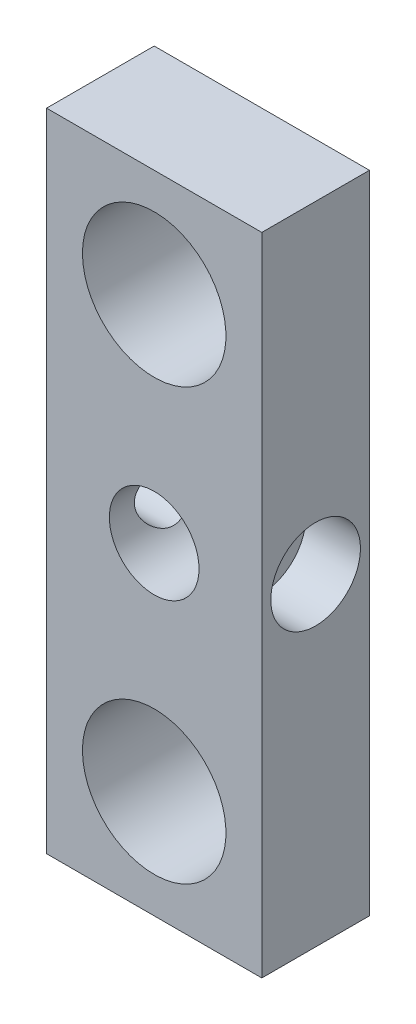
ISO-10303-21;
HEADER;
FILE_DESCRIPTION(('STEP AP214'),'2;1');
FILE_NAME('part.step','',(''),(''),'','','');
FILE_SCHEMA(('AUTOMOTIVE_DESIGN { 1 0 10303 214 1 1 1 1 }'));
ENDSEC;
DATA;
#1=APPLICATION_CONTEXT('core data for automotive mechanical design processes');
#2=APPLICATION_PROTOCOL_DEFINITION('international standard','automotive_design',2000,#1);
#3=PRODUCT_CONTEXT('',#1,'mechanical');
#4=PRODUCT('Part','Part','',(#3));
#5=PRODUCT_RELATED_PRODUCT_CATEGORY('part','',(#4));
#6=PRODUCT_DEFINITION_FORMATION('','',#4);
#7=PRODUCT_DEFINITION_CONTEXT('part definition',#1,'design');
#8=PRODUCT_DEFINITION('design','',#6,#7);
#9=PRODUCT_DEFINITION_SHAPE('','',#8);
#10=(LENGTH_UNIT() NAMED_UNIT(*) SI_UNIT(.MILLI.,.METRE.));
#11=(NAMED_UNIT(*) PLANE_ANGLE_UNIT() SI_UNIT($,.RADIAN.));
#12=(NAMED_UNIT(*) SI_UNIT($,.STERADIAN.) SOLID_ANGLE_UNIT());
#13=UNCERTAINTY_MEASURE_WITH_UNIT(LENGTH_MEASURE(1.E-05),#10,'distance_accuracy_value','');
#14=(GEOMETRIC_REPRESENTATION_CONTEXT(3) GLOBAL_UNCERTAINTY_ASSIGNED_CONTEXT((#13)) GLOBAL_UNIT_ASSIGNED_CONTEXT((#10,
#11,#12)) REPRESENTATION_CONTEXT('',''));
#15=CARTESIAN_POINT('',(0.,0.,0.));
#16=DIRECTION('',(0.,0.,1.));
#17=DIRECTION('',(1.,0.,0.));
#18=AXIS2_PLACEMENT_3D('',#15,#16,#17);
#19=CARTESIAN_POINT('',(0.,0.,9.525));
#20=DIRECTION('',(0.,0.,-1.));
#21=DIRECTION('',(-1.,0.,0.));
#22=AXIS2_PLACEMENT_3D('',#19,#20,#21);
#23=PLANE('',#22);
#24=DIRECTION('',(0.,1.,0.));
#25=VECTOR('',#24,1.);
#26=CARTESIAN_POINT('',(9.52500000000003,-228.6,9.525));
#27=LINE('',#26,#25);
#28=CARTESIAN_POINT('',(9.52500000000003,-228.6,9.525));
#29=VERTEX_POINT('',#28);
#30=CARTESIAN_POINT('',(9.52500000000002,-171.45,9.525));
#31=VERTEX_POINT('',#30);
#32=EDGE_CURVE('E91',#29,#31,#27,.T.);
#33=ORIENTED_EDGE('',*,*,#32,.T.);
#34=DIRECTION('',(-1.,0.,0.));
#35=VECTOR('',#34,1.);
#36=CARTESIAN_POINT('',(-9.52499999999998,-171.45,9.525));
#37=LINE('',#36,#35);
#38=CARTESIAN_POINT('',(-9.52499999999998,-171.45,9.525));
#39=VERTEX_POINT('',#38);
#40=EDGE_CURVE('E86',#31,#39,#37,.T.);
#41=ORIENTED_EDGE('',*,*,#40,.T.);
#42=DIRECTION('',(0.,-1.,0.));
#43=VECTOR('',#42,1.);
#44=CARTESIAN_POINT('',(-9.52499999999998,-228.6,9.525));
#45=LINE('',#44,#43);
#46=CARTESIAN_POINT('',(-9.52499999999998,-228.6,9.525));
#47=VERTEX_POINT('',#46);
#48=EDGE_CURVE('E89',#39,#47,#45,.T.);
#49=ORIENTED_EDGE('',*,*,#48,.T.);
#50=DIRECTION('',(1.,0.,0.));
#51=VECTOR('',#50,1.);
#52=CARTESIAN_POINT('',(-9.52499999999998,-228.6,9.525));
#53=LINE('',#52,#51);
#54=EDGE_CURVE('E56',#47,#29,#53,.T.);
#55=ORIENTED_EDGE('',*,*,#54,.T.);
#56=EDGE_LOOP('',(#33,#41,#49,#55));
#57=FACE_BOUND('',#56,.T.);
#58=CARTESIAN_POINT('',(0.,-200.025,9.525));
#59=DIRECTION('',(0.,0.,1.));
#60=DIRECTION('',(1.,0.,0.));
#61=AXIS2_PLACEMENT_3D('',#58,#59,#60);
#62=CIRCLE('',#61,3.96875);
#63=CARTESIAN_POINT('',(3.96875000000001,-200.025,9.525));
#64=VERTEX_POINT('',#63);
#65=EDGE_CURVE('E107',#64,#64,#62,.T.);
#66=ORIENTED_EDGE('',*,*,#65,.F.);
#67=EDGE_LOOP('',(#66));
#68=FACE_BOUND('',#67,.T.);
#69=CARTESIAN_POINT('',(0.,-180.975,9.525));
#70=DIRECTION('',(0.,0.,1.));
#71=DIRECTION('',(1.,0.,0.));
#72=AXIS2_PLACEMENT_3D('',#69,#70,#71);
#73=CIRCLE('',#72,6.34999999999999);
#74=CARTESIAN_POINT('',(-6.34999999999999,-180.975,9.525));
#75=VERTEX_POINT('',#74);
#76=EDGE_CURVE('E187',#75,#75,#73,.T.);
#77=ORIENTED_EDGE('',*,*,#76,.F.);
#78=EDGE_LOOP('',(#77));
#79=FACE_BOUND('',#78,.T.);
#80=CARTESIAN_POINT('',(0.,-219.075,9.525));
#81=DIRECTION('',(0.,0.,1.));
#82=DIRECTION('',(-1.,0.,0.));
#83=AXIS2_PLACEMENT_3D('',#80,#81,#82);
#84=CIRCLE('',#83,6.34999999999999);
#85=CARTESIAN_POINT('',(-6.34999999999998,-219.075,9.525));
#86=VERTEX_POINT('',#85);
#87=EDGE_CURVE('E179',#86,#86,#84,.T.);
#88=ORIENTED_EDGE('',*,*,#87,.F.);
#89=EDGE_LOOP('',(#88));
#90=FACE_BOUND('',#89,.T.);
#91=ADVANCED_FACE('F33',(#57,#68,#79,#90),#23,.F.);
#92=CARTESIAN_POINT('',(0.,0.,0.));
#93=DIRECTION('',(0.,0.,-1.));
#94=DIRECTION('',(-1.,0.,0.));
#95=AXIS2_PLACEMENT_3D('',#92,#93,#94);
#96=PLANE('',#95);
#97=CARTESIAN_POINT('',(0.,-180.975,0.));
#98=DIRECTION('',(0.,0.,1.));
#99=DIRECTION('',(1.,0.,0.));
#100=AXIS2_PLACEMENT_3D('',#97,#98,#99);
#101=CIRCLE('',#100,6.34999999999999);
#102=CARTESIAN_POINT('',(-6.34999999999999,-180.975,0.));
#103=VERTEX_POINT('',#102);
#104=EDGE_CURVE('E182',#103,#103,#101,.T.);
#105=ORIENTED_EDGE('',*,*,#104,.T.);
#106=EDGE_LOOP('',(#105));
#107=FACE_BOUND('',#106,.T.);
#108=DIRECTION('',(0.,1.,0.));
#109=VECTOR('',#108,1.);
#110=CARTESIAN_POINT('',(9.52500000000003,-228.6,0.));
#111=LINE('',#110,#109);
#112=CARTESIAN_POINT('',(9.52500000000003,-228.6,0.));
#113=VERTEX_POINT('',#112);
#114=CARTESIAN_POINT('',(9.52500000000002,-171.45,0.));
#115=VERTEX_POINT('',#114);
#116=EDGE_CURVE('E104',#113,#115,#111,.T.);
#117=ORIENTED_EDGE('',*,*,#116,.F.);
#118=DIRECTION('',(1.,0.,0.));
#119=VECTOR('',#118,1.);
#120=CARTESIAN_POINT('',(-9.52499999999998,-228.6,0.));
#121=LINE('',#120,#119);
#122=CARTESIAN_POINT('',(-9.52499999999998,-228.6,0.));
#123=VERTEX_POINT('',#122);
#124=EDGE_CURVE('E79',#123,#113,#121,.T.);
#125=ORIENTED_EDGE('',*,*,#124,.F.);
#126=DIRECTION('',(0.,-1.,0.));
#127=VECTOR('',#126,1.);
#128=CARTESIAN_POINT('',(-9.52499999999998,-228.6,0.));
#129=LINE('',#128,#127);
#130=CARTESIAN_POINT('',(-9.52499999999998,-171.45,0.));
#131=VERTEX_POINT('',#130);
#132=EDGE_CURVE('E73',#131,#123,#129,.T.);
#133=ORIENTED_EDGE('',*,*,#132,.F.);
#134=DIRECTION('',(-1.,0.,0.));
#135=VECTOR('',#134,1.);
#136=CARTESIAN_POINT('',(-9.52499999999998,-171.45,0.));
#137=LINE('',#136,#135);
#138=EDGE_CURVE('E95',#115,#131,#137,.T.);
#139=ORIENTED_EDGE('',*,*,#138,.F.);
#140=EDGE_LOOP('',(#117,#125,#133,#139));
#141=FACE_BOUND('',#140,.T.);
#142=CARTESIAN_POINT('',(0.,-200.025,0.));
#143=DIRECTION('',(0.,0.,1.));
#144=DIRECTION('',(1.,0.,0.));
#145=AXIS2_PLACEMENT_3D('',#142,#143,#144);
#146=CIRCLE('',#145,3.96875);
#147=CARTESIAN_POINT('',(3.96875000000001,-200.025,0.));
#148=VERTEX_POINT('',#147);
#149=EDGE_CURVE('E174',#148,#148,#146,.T.);
#150=ORIENTED_EDGE('',*,*,#149,.T.);
#151=EDGE_LOOP('',(#150));
#152=FACE_BOUND('',#151,.T.);
#153=CARTESIAN_POINT('',(0.,-219.075,0.));
#154=DIRECTION('',(0.,0.,1.));
#155=DIRECTION('',(-1.,0.,0.));
#156=AXIS2_PLACEMENT_3D('',#153,#154,#155);
#157=CIRCLE('',#156,6.34999999999999);
#158=CARTESIAN_POINT('',(-6.34999999999998,-219.075,0.));
#159=VERTEX_POINT('',#158);
#160=EDGE_CURVE('E177',#159,#159,#157,.T.);
#161=ORIENTED_EDGE('',*,*,#160,.T.);
#162=EDGE_LOOP('',(#161));
#163=FACE_BOUND('',#162,.T.);
#164=ADVANCED_FACE('F146',(#107,#141,#152,#163),#96,.T.);
#165=CARTESIAN_POINT('',(9.52500000000003,-228.6,9.525));
#166=DIRECTION('',(-1.,0.,0.));
#167=DIRECTION('',(0.,-1.,0.));
#168=AXIS2_PLACEMENT_3D('',#165,#166,#167);
#169=PLANE('',#168);
#170=CARTESIAN_POINT('',(9.52500000000002,-200.025,4.7625));
#171=DIRECTION('',(1.,0.,0.));
#172=DIRECTION('',(0.,0.,-1.));
#173=AXIS2_PLACEMENT_3D('',#170,#171,#172);
#174=CIRCLE('',#173,3.96874999999999);
#175=CARTESIAN_POINT('',(9.52500000000002,-200.025,0.793750000000009));
#176=VERTEX_POINT('',#175);
#177=EDGE_CURVE('E167',#176,#176,#174,.T.);
#178=ORIENTED_EDGE('',*,*,#177,.F.);
#179=EDGE_LOOP('',(#178));
#180=FACE_BOUND('',#179,.T.);
#181=ORIENTED_EDGE('',*,*,#116,.T.);
#182=DIRECTION('',(0.,0.,-1.));
#183=VECTOR('',#182,1.);
#184=CARTESIAN_POINT('',(9.52500000000002,-171.45,9.525));
#185=LINE('',#184,#183);
#186=EDGE_CURVE('E11',#31,#115,#185,.T.);
#187=ORIENTED_EDGE('',*,*,#186,.F.);
#188=ORIENTED_EDGE('',*,*,#32,.F.);
#189=DIRECTION('',(0.,0.,-1.));
#190=VECTOR('',#189,1.);
#191=CARTESIAN_POINT('',(9.52500000000003,-228.6,9.525));
#192=LINE('',#191,#190);
#193=EDGE_CURVE('E100',#29,#113,#192,.T.);
#194=ORIENTED_EDGE('',*,*,#193,.T.);
#195=EDGE_LOOP('',(#181,#187,#188,#194));
#196=FACE_BOUND('',#195,.T.);
#197=ADVANCED_FACE('F35',(#180,#196),#169,.F.);
#198=CARTESIAN_POINT('',(-9.52499999999998,-171.45,9.525));
#199=DIRECTION('',(0.,-1.,0.));
#200=DIRECTION('',(0.,0.,-1.));
#201=AXIS2_PLACEMENT_3D('',#198,#199,#200);
#202=PLANE('',#201);
#203=ORIENTED_EDGE('',*,*,#138,.T.);
#204=DIRECTION('',(0.,0.,-1.));
#205=VECTOR('',#204,1.);
#206=CARTESIAN_POINT('',(-9.52499999999998,-171.45,9.525));
#207=LINE('',#206,#205);
#208=EDGE_CURVE('E47',#39,#131,#207,.T.);
#209=ORIENTED_EDGE('',*,*,#208,.F.);
#210=ORIENTED_EDGE('',*,*,#40,.F.);
#211=ORIENTED_EDGE('',*,*,#186,.T.);
#212=EDGE_LOOP('',(#203,#209,#210,#211));
#213=FACE_BOUND('',#212,.T.);
#214=ADVANCED_FACE('F94',(#213),#202,.F.);
#215=CARTESIAN_POINT('',(-9.52499999999998,-228.6,9.525));
#216=DIRECTION('',(1.,0.,0.));
#217=DIRECTION('',(0.,1.,0.));
#218=AXIS2_PLACEMENT_3D('',#215,#216,#217);
#219=PLANE('',#218);
#220=CARTESIAN_POINT('',(-9.52499999999998,-200.025,4.7625));
#221=DIRECTION('',(1.,0.,0.));
#222=DIRECTION('',(0.,0.,-1.));
#223=AXIS2_PLACEMENT_3D('',#220,#221,#222);
#224=CIRCLE('',#223,2.55269999999999);
#225=CARTESIAN_POINT('',(-9.52499999999998,-200.025,2.20980000000001));
#226=VERTEX_POINT('',#225);
#227=EDGE_CURVE('E116',#226,#226,#224,.T.);
#228=ORIENTED_EDGE('',*,*,#227,.T.);
#229=EDGE_LOOP('',(#228));
#230=FACE_BOUND('',#229,.T.);
#231=ORIENTED_EDGE('',*,*,#132,.T.);
#232=DIRECTION('',(0.,0.,-1.));
#233=VECTOR('',#232,1.);
#234=CARTESIAN_POINT('',(-9.52499999999998,-228.6,9.525));
#235=LINE('',#234,#233);
#236=EDGE_CURVE('E96',#47,#123,#235,.T.);
#237=ORIENTED_EDGE('',*,*,#236,.F.);
#238=ORIENTED_EDGE('',*,*,#48,.F.);
#239=ORIENTED_EDGE('',*,*,#208,.T.);
#240=EDGE_LOOP('',(#231,#237,#238,#239));
#241=FACE_BOUND('',#240,.T.);
#242=ADVANCED_FACE('F98',(#230,#241),#219,.F.);
#243=CARTESIAN_POINT('',(-9.52499999999998,-228.6,9.525));
#244=DIRECTION('',(0.,1.,0.));
#245=DIRECTION('',(-1.,0.,0.));
#246=AXIS2_PLACEMENT_3D('',#243,#244,#245);
#247=PLANE('',#246);
#248=ORIENTED_EDGE('',*,*,#124,.T.);
#249=ORIENTED_EDGE('',*,*,#193,.F.);
#250=ORIENTED_EDGE('',*,*,#54,.F.);
#251=ORIENTED_EDGE('',*,*,#236,.T.);
#252=EDGE_LOOP('',(#248,#249,#250,#251));
#253=FACE_BOUND('',#252,.T.);
#254=ADVANCED_FACE('F141',(#253),#247,.F.);
#255=CARTESIAN_POINT('',(0.,-200.025,9.525));
#256=DIRECTION('',(0.,0.,-1.));
#257=DIRECTION('',(-1.,0.,0.));
#258=AXIS2_PLACEMENT_3D('',#255,#256,#257);
#259=CYLINDRICAL_SURFACE('',#258,3.96875);
#260=CARTESIAN_POINT('',(-3.96874999999999,-200.025,7.31519999999999));
#261=CARTESIAN_POINT('',(-3.96874288995877,-200.154100035397,7.31519239574755));
#262=CARTESIAN_POINT('',(-3.96239014442926,-200.283271929131,7.30534632098476));
#263=CARTESIAN_POINT('',(-3.9375926328164,-200.537557801145,7.26652704471239));
#264=CARTESIAN_POINT('',(-3.91913556813452,-200.662667516212,7.23753438910167));
#265=CARTESIAN_POINT('',(-3.87197245024943,-200.904745521398,7.16215197052856));
#266=CARTESIAN_POINT('',(-3.84331494650177,-201.021749293489,7.11584456608937));
#267=CARTESIAN_POINT('',(-3.7780980221099,-201.245900501831,7.00775723747599));
#268=CARTESIAN_POINT('',(-3.74153808977505,-201.353047299192,6.94597631133373));
#269=CARTESIAN_POINT('',(-3.65993919868051,-201.564376556599,6.80313211359416));
#270=CARTESIAN_POINT('',(-3.61445050002937,-201.667593092694,6.72090203976858));
#271=CARTESIAN_POINT('',(-3.52083856561401,-201.859698422032,6.54221954000098));
#272=CARTESIAN_POINT('',(-3.47271176556907,-201.948567157604,6.44574755874971));
#273=CARTESIAN_POINT('',(-3.37084437712008,-202.122604917032,6.22498782667975));
#274=CARTESIAN_POINT('',(-3.31730224750105,-202.205366926242,6.09869512459455));
#275=CARTESIAN_POINT('',(-3.21881655375193,-202.348304597213,5.83089470657257));
#276=CARTESIAN_POINT('',(-3.17385827591932,-202.408519081497,5.68941368767127));
#277=CARTESIAN_POINT('',(-3.11048712498131,-202.490311932018,5.43425180305238));
#278=CARTESIAN_POINT('',(-3.0881796497314,-202.51794567079,5.32348716695601));
#279=CARTESIAN_POINT('',(-3.05525831739712,-202.558193615777,5.09763400530854));
#280=CARTESIAN_POINT('',(-3.04462641697261,-202.570830999683,4.98255243658675));
#281=CARTESIAN_POINT('',(-3.03667651804736,-202.580312099832,4.75089022819935));
#282=CARTESIAN_POINT('',(-3.0394011156832,-202.577105285987,4.63430597663047));
#283=CARTESIAN_POINT('',(-3.05781275661559,-202.555009354282,4.40364168877021));
#284=CARTESIAN_POINT('',(-3.07351054528606,-202.536107236327,4.28956380888184));
#285=CARTESIAN_POINT('',(-3.11486559466004,-202.484597907209,4.07044221409866));
#286=CARTESIAN_POINT('',(-3.14019500424728,-202.452439191463,3.96522736320292));
#287=CARTESIAN_POINT('',(-3.1979828307048,-202.375783072805,3.76152316458199));
#288=CARTESIAN_POINT('',(-3.23044360746821,-202.331281584174,3.66303605736037));
#289=CARTESIAN_POINT('',(-3.30645936251751,-202.221266805434,3.45518103807285));
#290=CARTESIAN_POINT('',(-3.35094390379248,-202.153349598475,3.34742723809918));
#291=CARTESIAN_POINT('',(-3.44197036874696,-202.002770464495,3.14361705500284));
#292=CARTESIAN_POINT('',(-3.48851469581537,-201.920090952168,3.04757485528988));
#293=CARTESIAN_POINT('',(-3.58855142656399,-201.724264090888,2.85164582571457));
#294=CARTESIAN_POINT('',(-3.64172468838826,-201.608310140354,2.75437037311523));
#295=CARTESIAN_POINT('',(-3.740304894133,-201.358802404642,2.58069362539337));
#296=CARTESIAN_POINT('',(-3.78572002016536,-201.225267427868,2.50427028714545));
#297=CARTESIAN_POINT('',(-3.8560256205037,-200.971464979557,2.38849601252563));
#298=CARTESIAN_POINT('',(-3.88319999096843,-200.853813000873,2.3447995805729));
#299=CARTESIAN_POINT('',(-3.92708839224013,-200.611567401949,2.27491678582748));
#300=CARTESIAN_POINT('',(-3.9438108909968,-200.486979490465,2.24871624694428));
#301=CARTESIAN_POINT('',(-3.96529503931138,-200.233803459798,2.21514163454965));
#302=CARTESIAN_POINT('',(-3.97001527997666,-200.105203037131,2.20783273750842));
#303=CARTESIAN_POINT('',(-3.96690075676167,-199.848515731178,2.21267521291049));
#304=CARTESIAN_POINT('',(-3.95906542472272,-199.720428871393,2.22482746600028));
#305=CARTESIAN_POINT('',(-3.93238285529436,-199.475758607477,2.26666873160703));
#306=CARTESIAN_POINT('',(-3.91416626911603,-199.358930259486,2.29535440411375));
#307=CARTESIAN_POINT('',(-3.86872419212668,-199.132056487463,2.3681039843384));
#308=CARTESIAN_POINT('',(-3.84149719101009,-199.022012204231,2.41217047022157));
#309=CARTESIAN_POINT('',(-3.77777110584133,-198.802966074643,2.5177820302624));
#310=CARTESIAN_POINT('',(-3.74074139518548,-198.694623070284,2.58036582882888));
#311=CARTESIAN_POINT('',(-3.66131962651139,-198.489474120158,2.71950573789381));
#312=CARTESIAN_POINT('',(-3.61892351541568,-198.39267700311,2.79607242879957));
#313=CARTESIAN_POINT('',(-3.52498149191547,-198.197733158693,2.97436963458016));
#314=CARTESIAN_POINT('',(-3.47303024488055,-198.101661579763,3.0781588035964));
#315=CARTESIAN_POINT('',(-3.3707327954991,-197.927540775771,3.30068553254827));
#316=CARTESIAN_POINT('',(-3.32038699609809,-197.849496044989,3.41942680882271));
#317=CARTESIAN_POINT('',(-3.23315507810642,-197.722210976373,3.65397149851387));
#318=CARTESIAN_POINT('',(-3.19536965238836,-197.670534192412,3.76811394293822));
#319=CARTESIAN_POINT('',(-3.12971493827279,-197.583925058655,4.00534436345483));
#320=CARTESIAN_POINT('',(-3.10183210153404,-197.54896980819,4.12841983770966));
#321=CARTESIAN_POINT('',(-3.07052478181548,-197.510418430355,4.31819718523386));
#322=CARTESIAN_POINT('',(-3.06182348035192,-197.499862462419,4.38268767077191));
#323=CARTESIAN_POINT('',(-3.04843238405326,-197.483710835653,4.51268573907248));
#324=CARTESIAN_POINT('',(-3.04374046974626,-197.478112555995,4.57819276579235));
#325=CARTESIAN_POINT('',(-3.03861700071684,-197.472001773638,4.70958305668269));
#326=CARTESIAN_POINT('',(-3.03818354098362,-197.471486996845,4.77546613942598));
#327=CARTESIAN_POINT('',(-3.04158414028157,-197.475540222532,4.90694402258651));
#328=CARTESIAN_POINT('',(-3.04541782816428,-197.480107782961,4.97253884757769));
#329=CARTESIAN_POINT('',(-3.06129670590894,-197.499191456793,5.14842803197323));
#330=CARTESIAN_POINT('',(-3.07720928320341,-197.518430757786,5.25790626871106));
#331=CARTESIAN_POINT('',(-3.11874098847336,-197.570308672871,5.47166951756576));
#332=CARTESIAN_POINT('',(-3.14436976634308,-197.602960610769,5.57594924977039));
#333=CARTESIAN_POINT('',(-3.21255660700179,-197.693760277765,5.81260335751261));
#334=CARTESIAN_POINT('',(-3.25790538414438,-197.756815310382,5.94229284199566));
#335=CARTESIAN_POINT('',(-3.35459900916012,-197.902433968086,6.18778248015733));
#336=CARTESIAN_POINT('',(-3.40595296263275,-197.985027418265,6.3035609874417));
#337=CARTESIAN_POINT('',(-3.50976397652142,-198.169235489499,6.52118818488953));
#338=CARTESIAN_POINT('',(-3.56222675043007,-198.271079440187,6.62284021276039));
#339=CARTESIAN_POINT('',(-3.662587254342,-198.491677200751,6.80845474893499));
#340=CARTESIAN_POINT('',(-3.7104892298751,-198.610415022519,6.89243379848481));
#341=CARTESIAN_POINT('',(-3.79171652130198,-198.847078006889,7.03078794823429));
#342=CARTESIAN_POINT('',(-3.82611716667093,-198.963230143411,7.08755708018501));
#343=CARTESIAN_POINT('',(-3.88507625033696,-199.204908391698,7.18335766600571));
#344=CARTESIAN_POINT('',(-3.90965017430209,-199.330419381745,7.2224170413156));
#345=CARTESIAN_POINT('',(-3.94146624440678,-199.551160746579,7.27262133084724));
#346=CARTESIAN_POINT('',(-3.95164523341484,-199.644907881521,7.2885378973269));
#347=CARTESIAN_POINT('',(-3.96528997042524,-199.834090167235,7.30983040506741));
#348=CARTESIAN_POINT('',(-3.96875525815583,-199.929525433288,7.31520562364452));
#349=CARTESIAN_POINT('',(-3.96874999999999,-200.025,7.31519999999999));
#350=B_SPLINE_CURVE_WITH_KNOTS('',3,(#260,#261,#262,#263,#264,#265,#266,#267,#268,#269,#270,
#271,#272,#273,#274,#275,#276,#277,#278,#279,#280,#281,#282,#283,#284,#285,#286,#287,#288,#289,
#290,#291,#292,#293,#294,#295,#296,#297,#298,#299,#300,#301,#302,#303,#304,#305,#306,#307,#308,
#309,#310,#311,#312,#313,#314,#315,#316,#317,#318,#319,#320,#321,#322,#323,#324,#325,#326,#327,
#328,#329,#330,#331,#332,#333,#334,#335,#336,#337,#338,#339,#340,#341,#342,#343,#344,#345,#346,
#347,#348,#349),.UNSPECIFIED.,.T.,.F.,(4,2,2,2,2,2,2,2,2,2,2,2,2,2,2,2,2,2,2,2,2,2,2,2,2,2,2,2,
2,2,2,2,2,2,2,2,2,2,2,2,2,2,2,2,4),(0.,0.38691367811741,0.774221090380067,1.15970921715388,
1.54522231217408,1.96239237975703,2.38014067763134,2.85849211539694,3.33601609441295,
3.68355124766283,4.03054856374486,4.37865323166609,4.72704651540133,5.06451150888274,
5.40208834404886,5.8053809013845,6.20915711780945,6.68808384951322,7.16650232063056,
7.55010517606899,7.93339683798719,8.31800910803196,8.70263878285586,9.06607189442016,
9.42956595470904,9.81951674798394,10.2097638363838,10.6599352513404,11.1102187778516,
11.5013856960095,11.8920153540225,12.0895237460084,12.286927664944,12.4842432716233,
12.6815417175043,13.0167996147388,13.3523913579848,13.8034989086833,14.2552995628443,
14.7128669873816,15.1700042222516,15.5696940820669,15.9687515753719,16.2548698819666,
16.5410078033032),.UNSPECIFIED.);
#351=CARTESIAN_POINT('',(-3.96874999999999,-200.025,7.31519999999999));
#352=VERTEX_POINT('',#351);
#353=EDGE_CURVE('E37',#352,#352,#350,.T.);
#354=ORIENTED_EDGE('',*,*,#353,.F.);
#355=EDGE_LOOP('',(#354));
#356=FACE_BOUND('',#355,.T.);
#357=CARTESIAN_POINT('',(3.96875000000001,-200.025,2.20980000000001));
#358=CARTESIAN_POINT('',(3.96874288995878,-200.154100035397,2.20980760425245));
#359=CARTESIAN_POINT('',(3.96239014442928,-200.283271929131,2.21965367901524));
#360=CARTESIAN_POINT('',(3.93759263281642,-200.537557801145,2.25847295528762));
#361=CARTESIAN_POINT('',(3.91913556813454,-200.662667516212,2.28746561089834));
#362=CARTESIAN_POINT('',(3.87197245024944,-200.904745521398,2.36284802947145));
#363=CARTESIAN_POINT('',(3.84331494650179,-201.021749293489,2.40915543391063));
#364=CARTESIAN_POINT('',(3.77809802210991,-201.245900501831,2.51724276252401));
#365=CARTESIAN_POINT('',(3.74153808977506,-201.353047299192,2.57902368866628));
#366=CARTESIAN_POINT('',(3.65993919868052,-201.564376556599,2.72186788640586));
#367=CARTESIAN_POINT('',(3.61445050002938,-201.667593092694,2.80409796023144));
#368=CARTESIAN_POINT('',(3.52083856561403,-201.859698422032,2.98278045999903));
#369=CARTESIAN_POINT('',(3.47271176556909,-201.948567157604,3.07925244125029));
#370=CARTESIAN_POINT('',(3.3708443771201,-202.122604917032,3.30001217332025));
#371=CARTESIAN_POINT('',(3.31730224750107,-202.205366926242,3.42630487540546));
#372=CARTESIAN_POINT('',(3.21881655375195,-202.348304597213,3.69410529342744));
#373=CARTESIAN_POINT('',(3.17385827591933,-202.408519081497,3.83558631232875));
#374=CARTESIAN_POINT('',(3.11048712498132,-202.490311932018,4.09074819694764));
#375=CARTESIAN_POINT('',(3.08817964973142,-202.51794567079,4.20151283304401));
#376=CARTESIAN_POINT('',(3.05525831739714,-202.558193615777,4.42736599469148));
#377=CARTESIAN_POINT('',(3.04462641697262,-202.570830999683,4.54244756341327));
#378=CARTESIAN_POINT('',(3.03667651804738,-202.580312099832,4.77410977180067));
#379=CARTESIAN_POINT('',(3.03940111568322,-202.577105285987,4.89069402336955));
#380=CARTESIAN_POINT('',(3.0578127566156,-202.555009354282,5.12135831122981));
#381=CARTESIAN_POINT('',(3.07351054528608,-202.536107236327,5.23543619111818));
#382=CARTESIAN_POINT('',(3.11486559466006,-202.484597907209,5.45455778590136));
#383=CARTESIAN_POINT('',(3.1401950042473,-202.452439191463,5.5597726367971));
#384=CARTESIAN_POINT('',(3.19798283070482,-202.375783072805,5.76347683541803));
#385=CARTESIAN_POINT('',(3.23044360746822,-202.331281584174,5.86196394263964));
#386=CARTESIAN_POINT('',(3.30645936251753,-202.221266805434,6.06981896192716));
#387=CARTESIAN_POINT('',(3.3509439037925,-202.153349598475,6.17757276190082));
#388=CARTESIAN_POINT('',(3.44197036874698,-202.002770464495,6.38138294499717));
#389=CARTESIAN_POINT('',(3.48851469581539,-201.920090952168,6.47742514471013));
#390=CARTESIAN_POINT('',(3.58855142656401,-201.724264090888,6.67335417428544));
#391=CARTESIAN_POINT('',(3.64172468838828,-201.608310140354,6.77062962688478));
#392=CARTESIAN_POINT('',(3.74030489413302,-201.358802404642,6.94430637460665));
#393=CARTESIAN_POINT('',(3.78572002016539,-201.225267427868,7.02072971285457));
#394=CARTESIAN_POINT('',(3.85602562050372,-200.971464979557,7.13650398747439));
#395=CARTESIAN_POINT('',(3.88319999096846,-200.853813000873,7.18020041942712));
#396=CARTESIAN_POINT('',(3.92708839224015,-200.611567401949,7.25008321417254));
#397=CARTESIAN_POINT('',(3.94381089099682,-200.486979490465,7.27628375305573));
#398=CARTESIAN_POINT('',(3.96529503931141,-200.233803459798,7.30985836545036));
#399=CARTESIAN_POINT('',(3.97001527997668,-200.105203037131,7.31716726249159));
#400=CARTESIAN_POINT('',(3.96690075676168,-199.848515731178,7.31232478708951));
#401=CARTESIAN_POINT('',(3.95906542472273,-199.720428871393,7.30017253399971));
#402=CARTESIAN_POINT('',(3.93238285529435,-199.475758607477,7.25833126839294));
#403=CARTESIAN_POINT('',(3.91416626911602,-199.358930259486,7.22964559588621));
#404=CARTESIAN_POINT('',(3.86872419212667,-199.132056487463,7.15689601566155));
#405=CARTESIAN_POINT('',(3.84149719101007,-199.022012204231,7.11282952977838));
#406=CARTESIAN_POINT('',(3.77777110584131,-198.802966074643,7.00721796973754));
#407=CARTESIAN_POINT('',(3.74074139518545,-198.694623070284,6.94463417117104));
#408=CARTESIAN_POINT('',(3.66131962651135,-198.489474120158,6.8054942621061));
#409=CARTESIAN_POINT('',(3.61892351541565,-198.39267700311,6.72892757120034));
#410=CARTESIAN_POINT('',(3.52498149191543,-198.197733158693,6.55063036541975));
#411=CARTESIAN_POINT('',(3.47303024488052,-198.101661579763,6.44684119640351));
#412=CARTESIAN_POINT('',(3.37073279549907,-197.92754077577,6.22431446745163));
#413=CARTESIAN_POINT('',(3.32038699609806,-197.849496044989,6.10557319117718));
#414=CARTESIAN_POINT('',(3.2331550781064,-197.722210976373,5.87102850148602));
#415=CARTESIAN_POINT('',(3.19536965238834,-197.670534192412,5.75688605706167));
#416=CARTESIAN_POINT('',(3.12971493827278,-197.583925058655,5.51965563654506));
#417=CARTESIAN_POINT('',(3.10183210153404,-197.54896980819,5.39658016229024));
#418=CARTESIAN_POINT('',(3.07052478181548,-197.510418430354,5.20680281476604));
#419=CARTESIAN_POINT('',(3.06182348035193,-197.499862462419,5.142312329228));
#420=CARTESIAN_POINT('',(3.04843238405327,-197.483710835653,5.01231426092743));
#421=CARTESIAN_POINT('',(3.04374046974627,-197.478112555995,4.94680723420757));
#422=CARTESIAN_POINT('',(3.03861700071686,-197.472001773638,4.81541694331724));
#423=CARTESIAN_POINT('',(3.03818354098364,-197.471486996845,4.74953386057395));
#424=CARTESIAN_POINT('',(3.04158414028159,-197.475540222532,4.61805597741343));
#425=CARTESIAN_POINT('',(3.04541782816431,-197.480107782961,4.55246115242225));
#426=CARTESIAN_POINT('',(3.06129670590897,-197.499191456793,4.37657196802671));
#427=CARTESIAN_POINT('',(3.07720928320344,-197.518430757786,4.26709373128888));
#428=CARTESIAN_POINT('',(3.11874098847339,-197.570308672871,4.05333048243418));
#429=CARTESIAN_POINT('',(3.14436976634311,-197.602960610769,3.94905075022956));
#430=CARTESIAN_POINT('',(3.21255660700182,-197.693760277765,3.71239664248735));
#431=CARTESIAN_POINT('',(3.25790538414441,-197.756815310382,3.5827071580043));
#432=CARTESIAN_POINT('',(3.35459900916016,-197.902433968086,3.33721751984262));
#433=CARTESIAN_POINT('',(3.40595296263279,-197.985027418265,3.22143901255825));
#434=CARTESIAN_POINT('',(3.50976397652146,-198.169235489499,3.00381181511043));
#435=CARTESIAN_POINT('',(3.5622267504301,-198.271079440187,2.90215978723958));
#436=CARTESIAN_POINT('',(3.66258725434203,-198.491677200751,2.71654525106499));
#437=CARTESIAN_POINT('',(3.71048922987514,-198.610415022519,2.63256620151516));
#438=CARTESIAN_POINT('',(3.79171652130201,-198.847078006889,2.49421205176568));
#439=CARTESIAN_POINT('',(3.82611716667096,-198.963230143411,2.43744291981498));
#440=CARTESIAN_POINT('',(3.88507625033698,-199.204908391698,2.34164233399429));
#441=CARTESIAN_POINT('',(3.90965017430211,-199.330419381745,2.3025829586844));
#442=CARTESIAN_POINT('',(3.9414662444068,-199.551160746579,2.25237866915276));
#443=CARTESIAN_POINT('',(3.95164523341486,-199.644907881521,2.2364621026731));
#444=CARTESIAN_POINT('',(3.96528997042526,-199.834090167235,2.21516959493259));
#445=CARTESIAN_POINT('',(3.96875525815585,-199.929525433288,2.20979437635549));
#446=CARTESIAN_POINT('',(3.96875000000001,-200.025,2.20980000000001));
#447=B_SPLINE_CURVE_WITH_KNOTS('',3,(#357,#358,#359,#360,#361,#362,#363,#364,#365,#366,#367,
#368,#369,#370,#371,#372,#373,#374,#375,#376,#377,#378,#379,#380,#381,#382,#383,#384,#385,#386,
#387,#388,#389,#390,#391,#392,#393,#394,#395,#396,#397,#398,#399,#400,#401,#402,#403,#404,#405,
#406,#407,#408,#409,#410,#411,#412,#413,#414,#415,#416,#417,#418,#419,#420,#421,#422,#423,#424,
#425,#426,#427,#428,#429,#430,#431,#432,#433,#434,#435,#436,#437,#438,#439,#440,#441,#442,#443,
#444,#445,#446),.UNSPECIFIED.,.T.,.F.,(4,2,2,2,2,2,2,2,2,2,2,2,2,2,2,2,2,2,2,2,2,2,2,2,2,2,2,2,
2,2,2,2,2,2,2,2,2,2,2,2,2,2,2,2,4),(0.,0.386913678117409,0.774221090380067,1.15970921715385,
1.54522231217411,1.96239237975703,2.38014067763134,2.85849211539694,3.33601609441297,
3.68355124766284,4.03054856374487,4.3786532316661,4.72704651540134,5.06451150888274,
5.40208834404887,5.8053809013845,6.20915711780945,6.68808384951325,7.16650232063058,
7.55010517606905,7.93339683798727,8.31800910803207,8.702638782856,9.06607189442034,
9.42956595470917,9.81951674798408,10.2097638363839,10.6599352513405,11.1102187778517,
11.5013856960096,11.8920153540226,12.0895237460085,12.2869276649441,12.4842432716234,
12.6815417175043,13.0167996147389,13.3523913579848,13.8034989086833,14.2552995628444,
14.7128669873817,15.1700042222517,15.569694082067,15.9687515753719,16.2548698819666,
16.5410078033032),.UNSPECIFIED.);
#448=CARTESIAN_POINT('',(3.96875000000001,-200.025,2.20980000000001));
#449=VERTEX_POINT('',#448);
#450=EDGE_CURVE('E112',#449,#449,#447,.T.);
#451=ORIENTED_EDGE('',*,*,#450,.F.);
#452=EDGE_LOOP('',(#451));
#453=FACE_BOUND('',#452,.T.);
#454=ORIENTED_EDGE('',*,*,#65,.T.);
#455=EDGE_LOOP('',(#454));
#456=FACE_BOUND('',#455,.T.);
#457=ORIENTED_EDGE('',*,*,#149,.F.);
#458=EDGE_LOOP('',(#457));
#459=FACE_BOUND('',#458,.T.);
#460=ADVANCED_FACE('F117',(#356,#453,#456,#459),#259,.F.);
#461=CARTESIAN_POINT('',(0.,-180.975,9.525));
#462=DIRECTION('',(0.,0.,-1.));
#463=DIRECTION('',(-1.,0.,0.));
#464=AXIS2_PLACEMENT_3D('',#461,#462,#463);
#465=CYLINDRICAL_SURFACE('',#464,6.34999999999999);
#466=CARTESIAN_POINT('',(-6.34999999999999,-180.975,9.525));
#467=CARTESIAN_POINT('',(-6.34999999999999,-180.975,9.42578125));
#468=CARTESIAN_POINT('',(-6.34999999999999,-180.975,9.3265625));
#469=CARTESIAN_POINT('',(-6.34999999999999,-180.975,9.128125));
#470=CARTESIAN_POINT('',(-6.34999999999999,-180.975,9.02890625));
#471=CARTESIAN_POINT('',(-6.34999999999999,-180.975,8.83046875));
#472=CARTESIAN_POINT('',(-6.34999999999999,-180.975,8.73125));
#473=CARTESIAN_POINT('',(-6.34999999999999,-180.975,8.5328125));
#474=CARTESIAN_POINT('',(-6.34999999999999,-180.975,8.43359375));
#475=CARTESIAN_POINT('',(-6.34999999999999,-180.975,8.23515625));
#476=CARTESIAN_POINT('',(-6.34999999999999,-180.975,8.1359375));
#477=CARTESIAN_POINT('',(-6.34999999999999,-180.975,7.9375));
#478=CARTESIAN_POINT('',(-6.34999999999999,-180.975,7.83828125));
#479=CARTESIAN_POINT('',(-6.34999999999999,-180.975,7.63984375));
#480=CARTESIAN_POINT('',(-6.34999999999999,-180.975,7.540625));
#481=CARTESIAN_POINT('',(-6.34999999999999,-180.975,7.3421875));
#482=CARTESIAN_POINT('',(-6.34999999999999,-180.975,7.24296875));
#483=CARTESIAN_POINT('',(-6.34999999999999,-180.975,7.04453125));
#484=CARTESIAN_POINT('',(-6.34999999999999,-180.975,6.9453125));
#485=CARTESIAN_POINT('',(-6.34999999999999,-180.975,6.746875));
#486=CARTESIAN_POINT('',(-6.34999999999999,-180.975,6.64765625));
#487=CARTESIAN_POINT('',(-6.34999999999999,-180.975,6.44921875));
#488=CARTESIAN_POINT('',(-6.34999999999999,-180.975,6.35));
#489=CARTESIAN_POINT('',(-6.34999999999999,-180.975,6.1515625));
#490=CARTESIAN_POINT('',(-6.34999999999999,-180.975,6.05234375));
#491=CARTESIAN_POINT('',(-6.34999999999999,-180.975,5.85390625));
#492=CARTESIAN_POINT('',(-6.34999999999999,-180.975,5.7546875));
#493=CARTESIAN_POINT('',(-6.34999999999999,-180.975,5.55625));
#494=CARTESIAN_POINT('',(-6.34999999999999,-180.975,5.45703125));
#495=CARTESIAN_POINT('',(-6.34999999999999,-180.975,5.25859375));
#496=CARTESIAN_POINT('',(-6.34999999999999,-180.975,5.159375));
#497=CARTESIAN_POINT('',(-6.34999999999999,-180.975,4.9609375));
#498=CARTESIAN_POINT('',(-6.34999999999999,-180.975,4.86171875));
#499=CARTESIAN_POINT('',(-6.34999999999999,-180.975,4.66328125));
#500=CARTESIAN_POINT('',(-6.34999999999999,-180.975,4.5640625));
#501=CARTESIAN_POINT('',(-6.34999999999999,-180.975,4.365625));
#502=CARTESIAN_POINT('',(-6.34999999999999,-180.975,4.26640625));
#503=CARTESIAN_POINT('',(-6.34999999999999,-180.975,4.06796875));
#504=CARTESIAN_POINT('',(-6.34999999999999,-180.975,3.96875));
#505=CARTESIAN_POINT('',(-6.34999999999999,-180.975,3.7703125));
#506=CARTESIAN_POINT('',(-6.34999999999999,-180.975,3.67109375));
#507=CARTESIAN_POINT('',(-6.34999999999999,-180.975,3.47265625));
#508=CARTESIAN_POINT('',(-6.34999999999999,-180.975,3.3734375));
#509=CARTESIAN_POINT('',(-6.34999999999999,-180.975,3.175));
#510=CARTESIAN_POINT('',(-6.34999999999999,-180.975,3.07578125));
#511=CARTESIAN_POINT('',(-6.34999999999999,-180.975,2.87734375));
#512=CARTESIAN_POINT('',(-6.34999999999999,-180.975,2.778125));
#513=CARTESIAN_POINT('',(-6.34999999999999,-180.975,2.5796875));
#514=CARTESIAN_POINT('',(-6.34999999999999,-180.975,2.48046875));
#515=CARTESIAN_POINT('',(-6.34999999999999,-180.975,2.28203125));
#516=CARTESIAN_POINT('',(-6.34999999999999,-180.975,2.1828125));
#517=CARTESIAN_POINT('',(-6.34999999999999,-180.975,1.984375));
#518=CARTESIAN_POINT('',(-6.34999999999999,-180.975,1.88515625));
#519=CARTESIAN_POINT('',(-6.34999999999999,-180.975,1.68671875));
#520=CARTESIAN_POINT('',(-6.34999999999999,-180.975,1.5875));
#521=CARTESIAN_POINT('',(-6.34999999999999,-180.975,1.3890625));
#522=CARTESIAN_POINT('',(-6.34999999999999,-180.975,1.28984375));
#523=CARTESIAN_POINT('',(-6.34999999999999,-180.975,1.09140625));
#524=CARTESIAN_POINT('',(-6.34999999999999,-180.975,0.992187500000001));
#525=CARTESIAN_POINT('',(-6.34999999999999,-180.975,0.793750000000001));
#526=CARTESIAN_POINT('',(-6.34999999999999,-180.975,0.69453125));
#527=CARTESIAN_POINT('',(-6.34999999999999,-180.975,0.49609375));
#528=CARTESIAN_POINT('',(-6.34999999999999,-180.975,0.396875));
#529=CARTESIAN_POINT('',(-6.34999999999999,-180.975,0.1984375));
#530=CARTESIAN_POINT('',(-6.34999999999999,-180.975,0.0992187500000001));
#531=CARTESIAN_POINT('',(-6.34999999999999,-180.975,0.));
#532=B_SPLINE_CURVE_WITH_KNOTS('',3,(#466,#467,#468,#469,#470,#471,#472,#473,#474,#475,#476,
#477,#478,#479,#480,#481,#482,#483,#484,#485,#486,#487,#488,#489,#490,#491,#492,#493,#494,#495,
#496,#497,#498,#499,#500,#501,#502,#503,#504,#505,#506,#507,#508,#509,#510,#511,#512,#513,#514,
#515,#516,#517,#518,#519,#520,#521,#522,#523,#524,#525,#526,#527,#528,#529,#530,#531),
.UNSPECIFIED.,.F.,.F.,(4,2,2,2,2,2,2,2,2,2,2,2,2,2,2,2,2,2,2,2,2,2,2,2,2,2,2,2,2,2,2,2,4),(0.,
0.297656249999998,0.595312499999999,0.892968749999999,1.190625,1.48828125,1.7859375,2.08359375,
2.38125,2.67890625,2.9765625,3.27421875,3.571875,3.86953125,4.1671875,4.46484375,4.7625,
5.06015625,5.3578125,5.65546875,5.953125,6.25078125,6.5484375,6.84609375,7.14375,7.44140625,
7.7390625,8.03671875,8.334375,8.63203125,8.9296875,9.22734375,9.525),.UNSPECIFIED.);
#533=EDGE_CURVE('BSEAM134',#75,#103,#532,.T.);
#534=ORIENTED_EDGE('',*,*,#76,.T.);
#535=ORIENTED_EDGE('',*,*,#104,.F.);
#536=ORIENTED_EDGE('',*,*,#533,.T.);
#537=ORIENTED_EDGE('',*,*,#533,.F.);
#538=EDGE_LOOP('',(#534,#536,#535,#537));
#539=FACE_BOUND('',#538,.T.);
#540=ADVANCED_FACE('F134',(#539),#465,.F.);
#541=CARTESIAN_POINT('',(0.,-219.075,9.525));
#542=DIRECTION('',(0.,0.,-1.));
#543=DIRECTION('',(-1.,0.,0.));
#544=AXIS2_PLACEMENT_3D('',#541,#542,#543);
#545=CYLINDRICAL_SURFACE('',#544,6.34999999999999);
#546=CARTESIAN_POINT('',(-6.34999999999998,-219.075,9.525));
#547=CARTESIAN_POINT('',(-6.34999999999998,-219.075,9.42578125));
#548=CARTESIAN_POINT('',(-6.34999999999998,-219.075,9.3265625));
#549=CARTESIAN_POINT('',(-6.34999999999998,-219.075,9.128125));
#550=CARTESIAN_POINT('',(-6.34999999999998,-219.075,9.02890625));
#551=CARTESIAN_POINT('',(-6.34999999999998,-219.075,8.83046875));
#552=CARTESIAN_POINT('',(-6.34999999999998,-219.075,8.73125));
#553=CARTESIAN_POINT('',(-6.34999999999998,-219.075,8.5328125));
#554=CARTESIAN_POINT('',(-6.34999999999998,-219.075,8.43359375));
#555=CARTESIAN_POINT('',(-6.34999999999998,-219.075,8.23515625));
#556=CARTESIAN_POINT('',(-6.34999999999998,-219.075,8.1359375));
#557=CARTESIAN_POINT('',(-6.34999999999998,-219.075,7.9375));
#558=CARTESIAN_POINT('',(-6.34999999999998,-219.075,7.83828125));
#559=CARTESIAN_POINT('',(-6.34999999999998,-219.075,7.63984375));
#560=CARTESIAN_POINT('',(-6.34999999999998,-219.075,7.540625));
#561=CARTESIAN_POINT('',(-6.34999999999998,-219.075,7.3421875));
#562=CARTESIAN_POINT('',(-6.34999999999998,-219.075,7.24296875));
#563=CARTESIAN_POINT('',(-6.34999999999998,-219.075,7.04453125));
#564=CARTESIAN_POINT('',(-6.34999999999998,-219.075,6.9453125));
#565=CARTESIAN_POINT('',(-6.34999999999998,-219.075,6.746875));
#566=CARTESIAN_POINT('',(-6.34999999999998,-219.075,6.64765625));
#567=CARTESIAN_POINT('',(-6.34999999999998,-219.075,6.44921875));
#568=CARTESIAN_POINT('',(-6.34999999999998,-219.075,6.35));
#569=CARTESIAN_POINT('',(-6.34999999999998,-219.075,6.1515625));
#570=CARTESIAN_POINT('',(-6.34999999999998,-219.075,6.05234375));
#571=CARTESIAN_POINT('',(-6.34999999999998,-219.075,5.85390625));
#572=CARTESIAN_POINT('',(-6.34999999999998,-219.075,5.7546875));
#573=CARTESIAN_POINT('',(-6.34999999999998,-219.075,5.55625));
#574=CARTESIAN_POINT('',(-6.34999999999998,-219.075,5.45703125));
#575=CARTESIAN_POINT('',(-6.34999999999998,-219.075,5.25859375));
#576=CARTESIAN_POINT('',(-6.34999999999998,-219.075,5.159375));
#577=CARTESIAN_POINT('',(-6.34999999999998,-219.075,4.9609375));
#578=CARTESIAN_POINT('',(-6.34999999999998,-219.075,4.86171875));
#579=CARTESIAN_POINT('',(-6.34999999999998,-219.075,4.66328125));
#580=CARTESIAN_POINT('',(-6.34999999999998,-219.075,4.5640625));
#581=CARTESIAN_POINT('',(-6.34999999999998,-219.075,4.365625));
#582=CARTESIAN_POINT('',(-6.34999999999998,-219.075,4.26640625));
#583=CARTESIAN_POINT('',(-6.34999999999998,-219.075,4.06796875));
#584=CARTESIAN_POINT('',(-6.34999999999998,-219.075,3.96875));
#585=CARTESIAN_POINT('',(-6.34999999999998,-219.075,3.7703125));
#586=CARTESIAN_POINT('',(-6.34999999999998,-219.075,3.67109375));
#587=CARTESIAN_POINT('',(-6.34999999999998,-219.075,3.47265625));
#588=CARTESIAN_POINT('',(-6.34999999999998,-219.075,3.3734375));
#589=CARTESIAN_POINT('',(-6.34999999999998,-219.075,3.175));
#590=CARTESIAN_POINT('',(-6.34999999999998,-219.075,3.07578125));
#591=CARTESIAN_POINT('',(-6.34999999999998,-219.075,2.87734375));
#592=CARTESIAN_POINT('',(-6.34999999999998,-219.075,2.778125));
#593=CARTESIAN_POINT('',(-6.34999999999998,-219.075,2.5796875));
#594=CARTESIAN_POINT('',(-6.34999999999998,-219.075,2.48046875));
#595=CARTESIAN_POINT('',(-6.34999999999998,-219.075,2.28203125));
#596=CARTESIAN_POINT('',(-6.34999999999998,-219.075,2.1828125));
#597=CARTESIAN_POINT('',(-6.34999999999998,-219.075,1.984375));
#598=CARTESIAN_POINT('',(-6.34999999999998,-219.075,1.88515625));
#599=CARTESIAN_POINT('',(-6.34999999999998,-219.075,1.68671875));
#600=CARTESIAN_POINT('',(-6.34999999999998,-219.075,1.5875));
#601=CARTESIAN_POINT('',(-6.34999999999998,-219.075,1.3890625));
#602=CARTESIAN_POINT('',(-6.34999999999998,-219.075,1.28984375));
#603=CARTESIAN_POINT('',(-6.34999999999998,-219.075,1.09140625));
#604=CARTESIAN_POINT('',(-6.34999999999998,-219.075,0.992187500000001));
#605=CARTESIAN_POINT('',(-6.34999999999998,-219.075,0.793750000000001));
#606=CARTESIAN_POINT('',(-6.34999999999998,-219.075,0.69453125));
#607=CARTESIAN_POINT('',(-6.34999999999998,-219.075,0.49609375));
#608=CARTESIAN_POINT('',(-6.34999999999998,-219.075,0.396875));
#609=CARTESIAN_POINT('',(-6.34999999999998,-219.075,0.1984375));
#610=CARTESIAN_POINT('',(-6.34999999999998,-219.075,0.0992187500000001));
#611=CARTESIAN_POINT('',(-6.34999999999998,-219.075,0.));
#612=B_SPLINE_CURVE_WITH_KNOTS('',3,(#546,#547,#548,#549,#550,#551,#552,#553,#554,#555,#556,
#557,#558,#559,#560,#561,#562,#563,#564,#565,#566,#567,#568,#569,#570,#571,#572,#573,#574,#575,
#576,#577,#578,#579,#580,#581,#582,#583,#584,#585,#586,#587,#588,#589,#590,#591,#592,#593,#594,
#595,#596,#597,#598,#599,#600,#601,#602,#603,#604,#605,#606,#607,#608,#609,#610,#611),
.UNSPECIFIED.,.F.,.F.,(4,2,2,2,2,2,2,2,2,2,2,2,2,2,2,2,2,2,2,2,2,2,2,2,2,2,2,2,2,2,2,2,4),(0.,
0.297656249999998,0.595312499999999,0.892968749999999,1.190625,1.48828125,1.7859375,2.08359375,
2.38125,2.67890625,2.9765625,3.27421875,3.571875,3.86953125,4.1671875,4.46484375,4.7625,
5.06015625,5.3578125,5.65546875,5.953125,6.25078125,6.5484375,6.84609375,7.14375,7.44140625,
7.7390625,8.03671875,8.334375,8.63203125,8.9296875,9.22734375,9.525),.UNSPECIFIED.);
#613=EDGE_CURVE('BSEAM130',#86,#159,#612,.T.);
#614=ORIENTED_EDGE('',*,*,#87,.T.);
#615=ORIENTED_EDGE('',*,*,#160,.F.);
#616=ORIENTED_EDGE('',*,*,#613,.T.);
#617=ORIENTED_EDGE('',*,*,#613,.F.);
#618=EDGE_LOOP('',(#614,#616,#615,#617));
#619=FACE_BOUND('',#618,.T.);
#620=ADVANCED_FACE('F130',(#619),#545,.F.);
#621=CARTESIAN_POINT('',(9.52500000000002,-200.025,4.7625));
#622=DIRECTION('',(1.,0.,0.));
#623=DIRECTION('',(0.,0.,-1.));
#624=AXIS2_PLACEMENT_3D('',#621,#622,#623);
#625=CYLINDRICAL_SURFACE('',#624,3.96874999999999);
#626=CARTESIAN_POINT('',(4.69900000000002,-200.025,4.7625));
#627=DIRECTION('',(1.,0.,0.));
#628=DIRECTION('',(0.,0.,-1.));
#629=AXIS2_PLACEMENT_3D('',#626,#627,#628);
#630=CIRCLE('',#629,3.96874999999999);
#631=CARTESIAN_POINT('',(4.69900000000002,-200.025,0.793750000000009));
#632=VERTEX_POINT('',#631);
#633=EDGE_CURVE('E206',#632,#632,#630,.T.);
#634=ORIENTED_EDGE('',*,*,#633,.F.);
#635=EDGE_LOOP('',(#634));
#636=FACE_BOUND('',#635,.T.);
#637=ORIENTED_EDGE('',*,*,#177,.T.);
#638=EDGE_LOOP('',(#637));
#639=FACE_BOUND('',#638,.T.);
#640=ADVANCED_FACE('F133',(#636,#639),#625,.F.);
#641=CARTESIAN_POINT('',(4.69900000000002,-197.4723,4.7625));
#642=DIRECTION('',(-1.,0.,0.));
#643=DIRECTION('',(0.,0.,1.));
#644=AXIS2_PLACEMENT_3D('',#641,#642,#643);
#645=PLANE('',#644);
#646=CARTESIAN_POINT('',(4.69900000000002,-200.025,4.7625));
#647=DIRECTION('',(1.,0.,0.));
#648=DIRECTION('',(0.,0.,-1.));
#649=AXIS2_PLACEMENT_3D('',#646,#647,#648);
#650=CIRCLE('',#649,2.55269999999999);
#651=CARTESIAN_POINT('',(4.69900000000002,-200.025,2.20980000000001));
#652=VERTEX_POINT('',#651);
#653=EDGE_CURVE('E203',#652,#652,#650,.T.);
#654=ORIENTED_EDGE('',*,*,#653,.F.);
#655=EDGE_LOOP('',(#654));
#656=FACE_BOUND('',#655,.T.);
#657=ORIENTED_EDGE('',*,*,#633,.T.);
#658=EDGE_LOOP('',(#657));
#659=FACE_BOUND('',#658,.T.);
#660=ADVANCED_FACE('F127',(#656,#659),#645,.F.);
#661=CARTESIAN_POINT('',(9.52500000000002,-200.025,4.7625));
#662=DIRECTION('',(1.,0.,0.));
#663=DIRECTION('',(0.,0.,-1.));
#664=AXIS2_PLACEMENT_3D('',#661,#662,#663);
#665=CYLINDRICAL_SURFACE('',#664,2.55269999999999);
#666=ORIENTED_EDGE('',*,*,#450,.T.);
#667=EDGE_LOOP('',(#666));
#668=FACE_BOUND('',#667,.T.);
#669=ORIENTED_EDGE('',*,*,#653,.T.);
#670=EDGE_LOOP('',(#669));
#671=FACE_BOUND('',#670,.T.);
#672=ADVANCED_FACE('F121',(#668,#671),#665,.F.);
#673=ORIENTED_EDGE('',*,*,#353,.T.);
#674=EDGE_LOOP('',(#673));
#675=FACE_BOUND('',#674,.T.);
#676=ORIENTED_EDGE('',*,*,#227,.F.);
#677=EDGE_LOOP('',(#676));
#678=FACE_BOUND('',#677,.T.);
#679=ADVANCED_FACE('F126',(#675,#678),#665,.F.);
#680=CLOSED_SHELL('',(#91,#164,#197,#214,#242,#254,#460,#540,#620,#640,#660,#672,#679));
#681=MANIFOLD_SOLID_BREP('B2',#680);
#682=ADVANCED_BREP_SHAPE_REPRESENTATION('',(#18,#681),#14);
#683=SHAPE_DEFINITION_REPRESENTATION(#9,#682);
ENDSEC;
END-ISO-10303-21;
